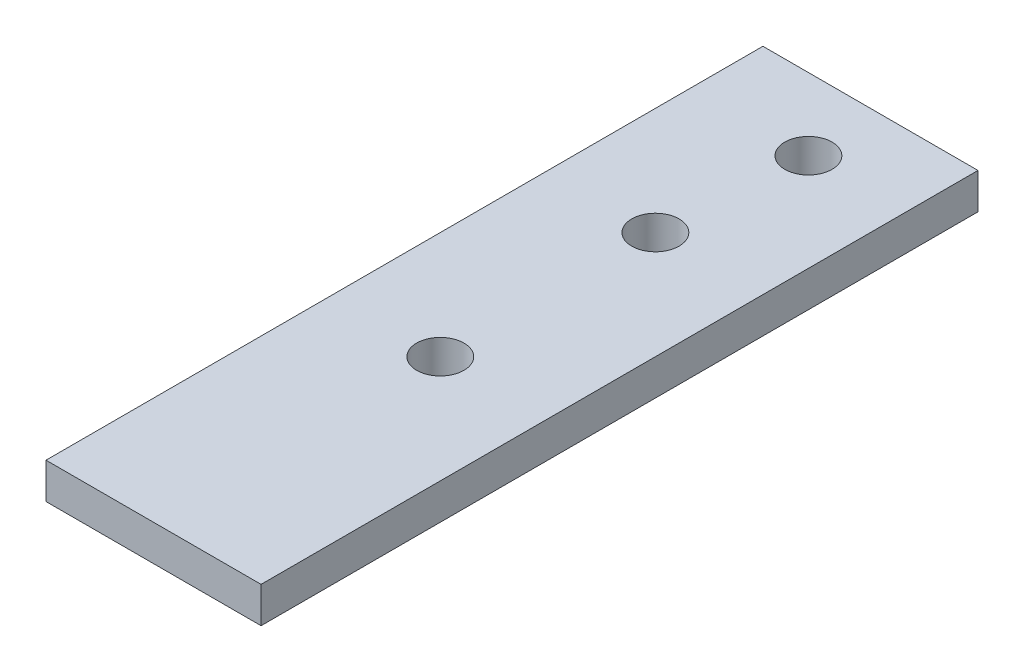
ISO-10303-21;
HEADER;
FILE_DESCRIPTION(('STEP AP214'),'2;1');
FILE_NAME('part.step','',(''),(''),'','','');
FILE_SCHEMA(('AUTOMOTIVE_DESIGN { 1 0 10303 214 1 1 1 1 }'));
ENDSEC;
DATA;
#1=APPLICATION_CONTEXT('core data for automotive mechanical design processes');
#2=APPLICATION_PROTOCOL_DEFINITION('international standard','automotive_design',2000,#1);
#3=PRODUCT_CONTEXT('',#1,'mechanical');
#4=PRODUCT('Part','Part','',(#3));
#5=PRODUCT_RELATED_PRODUCT_CATEGORY('part','',(#4));
#6=PRODUCT_DEFINITION_FORMATION('','',#4);
#7=PRODUCT_DEFINITION_CONTEXT('part definition',#1,'design');
#8=PRODUCT_DEFINITION('design','',#6,#7);
#9=PRODUCT_DEFINITION_SHAPE('','',#8);
#10=(LENGTH_UNIT() NAMED_UNIT(*) SI_UNIT(.MILLI.,.METRE.));
#11=(NAMED_UNIT(*) PLANE_ANGLE_UNIT() SI_UNIT($,.RADIAN.));
#12=(NAMED_UNIT(*) SI_UNIT($,.STERADIAN.) SOLID_ANGLE_UNIT());
#13=UNCERTAINTY_MEASURE_WITH_UNIT(LENGTH_MEASURE(1.E-05),#10,'distance_accuracy_value','');
#14=(GEOMETRIC_REPRESENTATION_CONTEXT(3) GLOBAL_UNCERTAINTY_ASSIGNED_CONTEXT((#13)) GLOBAL_UNIT_ASSIGNED_CONTEXT((#10,
#11,#12)) REPRESENTATION_CONTEXT('',''));
#15=CARTESIAN_POINT('',(0.,0.,0.));
#16=DIRECTION('',(0.,0.,1.));
#17=DIRECTION('',(1.,0.,0.));
#18=AXIS2_PLACEMENT_3D('',#15,#16,#17);
#19=CARTESIAN_POINT('',(0.,6.35,0.));
#20=DIRECTION('',(0.,1.,0.));
#21=DIRECTION('',(0.,0.,1.));
#22=AXIS2_PLACEMENT_3D('',#19,#20,#21);
#23=PLANE('',#22);
#24=CARTESIAN_POINT('',(19.05,6.35,-50.8));
#25=DIRECTION('',(0.,1.,0.));
#26=DIRECTION('',(0.,0.,1.));
#27=AXIS2_PLACEMENT_3D('',#24,#25,#26);
#28=CIRCLE('',#27,4.191);
#29=CARTESIAN_POINT('',(19.05,6.35,-46.609));
#30=VERTEX_POINT('',#29);
#31=EDGE_CURVE('E159',#30,#30,#28,.T.);
#32=ORIENTED_EDGE('',*,*,#31,.F.);
#33=EDGE_LOOP('',(#32));
#34=FACE_BOUND('',#33,.T.);
#35=DIRECTION('',(1.,0.,0.));
#36=VECTOR('',#35,1.);
#37=CARTESIAN_POINT('',(0.,6.35,-88.9));
#38=LINE('',#37,#36);
#39=CARTESIAN_POINT('',(0.,6.35,-88.9));
#40=VERTEX_POINT('',#39);
#41=CARTESIAN_POINT('',(38.1,6.35,-88.9));
#42=VERTEX_POINT('',#41);
#43=EDGE_CURVE('E134',#40,#42,#38,.T.);
#44=ORIENTED_EDGE('',*,*,#43,.F.);
#45=DIRECTION('',(0.,0.,-1.));
#46=VECTOR('',#45,1.);
#47=CARTESIAN_POINT('',(0.,6.35,0.));
#48=LINE('',#47,#46);
#49=CARTESIAN_POINT('',(0.,6.35,38.1));
#50=VERTEX_POINT('',#49);
#51=EDGE_CURVE('E114',#50,#40,#48,.T.);
#52=ORIENTED_EDGE('',*,*,#51,.F.);
#53=DIRECTION('',(-1.,0.,0.));
#54=VECTOR('',#53,1.);
#55=CARTESIAN_POINT('',(0.,6.35,38.1));
#56=LINE('',#55,#54);
#57=CARTESIAN_POINT('',(38.1,6.35,38.1));
#58=VERTEX_POINT('',#57);
#59=EDGE_CURVE('E147',#58,#50,#56,.T.);
#60=ORIENTED_EDGE('',*,*,#59,.F.);
#61=DIRECTION('',(0.,0.,-1.));
#62=VECTOR('',#61,1.);
#63=CARTESIAN_POINT('',(38.1,6.35,0.));
#64=LINE('',#63,#62);
#65=EDGE_CURVE('E172',#58,#42,#64,.T.);
#66=ORIENTED_EDGE('',*,*,#65,.T.);
#67=EDGE_LOOP('',(#44,#52,#60,#66));
#68=FACE_BOUND('',#67,.T.);
#69=CARTESIAN_POINT('',(19.05,6.35,-12.7));
#70=DIRECTION('',(0.,1.,0.));
#71=DIRECTION('',(0.,0.,1.));
#72=AXIS2_PLACEMENT_3D('',#69,#70,#71);
#73=CIRCLE('',#72,4.191);
#74=CARTESIAN_POINT('',(19.05,6.35,-8.509));
#75=VERTEX_POINT('',#74);
#76=EDGE_CURVE('E165',#75,#75,#73,.T.);
#77=ORIENTED_EDGE('',*,*,#76,.F.);
#78=EDGE_LOOP('',(#77));
#79=FACE_BOUND('',#78,.T.);
#80=CARTESIAN_POINT('',(20.8218144331006,6.35,-76.1381268765995));
#81=DIRECTION('',(0.,1.,0.));
#82=DIRECTION('',(0.,0.,1.));
#83=AXIS2_PLACEMENT_3D('',#80,#81,#82);
#84=CIRCLE('',#83,4.19100000000001);
#85=CARTESIAN_POINT('',(20.8218144331006,6.35,-71.9471268765995));
#86=VERTEX_POINT('',#85);
#87=EDGE_CURVE('E153',#86,#86,#84,.T.);
#88=ORIENTED_EDGE('',*,*,#87,.F.);
#89=EDGE_LOOP('',(#88));
#90=FACE_BOUND('',#89,.T.);
#91=ADVANCED_FACE('F84',(#34,#68,#79,#90),#23,.T.);
#92=CARTESIAN_POINT('',(0.,0.,0.));
#93=DIRECTION('',(0.,1.,0.));
#94=DIRECTION('',(0.,0.,1.));
#95=AXIS2_PLACEMENT_3D('',#92,#93,#94);
#96=PLANE('',#95);
#97=DIRECTION('',(1.,0.,0.));
#98=VECTOR('',#97,1.);
#99=CARTESIAN_POINT('',(0.,0.,-88.9));
#100=LINE('',#99,#98);
#101=CARTESIAN_POINT('',(0.,0.,-88.9));
#102=VERTEX_POINT('',#101);
#103=CARTESIAN_POINT('',(38.1,0.,-88.9));
#104=VERTEX_POINT('',#103);
#105=EDGE_CURVE('E168',#102,#104,#100,.T.);
#106=ORIENTED_EDGE('',*,*,#105,.T.);
#107=DIRECTION('',(0.,0.,-1.));
#108=VECTOR('',#107,1.);
#109=CARTESIAN_POINT('',(38.1,0.,0.));
#110=LINE('',#109,#108);
#111=CARTESIAN_POINT('',(38.1,0.,38.1));
#112=VERTEX_POINT('',#111);
#113=EDGE_CURVE('E135',#112,#104,#110,.T.);
#114=ORIENTED_EDGE('',*,*,#113,.F.);
#115=DIRECTION('',(1.,0.,0.));
#116=VECTOR('',#115,1.);
#117=CARTESIAN_POINT('',(0.,0.,38.1));
#118=LINE('',#117,#116);
#119=CARTESIAN_POINT('',(0.,0.,38.1));
#120=VERTEX_POINT('',#119);
#121=EDGE_CURVE('E138',#120,#112,#118,.T.);
#122=ORIENTED_EDGE('',*,*,#121,.F.);
#123=DIRECTION('',(0.,0.,-1.));
#124=VECTOR('',#123,1.);
#125=CARTESIAN_POINT('',(0.,0.,0.));
#126=LINE('',#125,#124);
#127=EDGE_CURVE('E127',#120,#102,#126,.T.);
#128=ORIENTED_EDGE('',*,*,#127,.T.);
#129=EDGE_LOOP('',(#106,#114,#122,#128));
#130=FACE_BOUND('',#129,.T.);
#131=CARTESIAN_POINT('',(19.05,0.,-12.7));
#132=DIRECTION('',(0.,1.,0.));
#133=DIRECTION('',(0.,0.,1.));
#134=AXIS2_PLACEMENT_3D('',#131,#132,#133);
#135=CIRCLE('',#134,4.191);
#136=CARTESIAN_POINT('',(19.05,0.,-8.509));
#137=VERTEX_POINT('',#136);
#138=EDGE_CURVE('E162',#137,#137,#135,.T.);
#139=ORIENTED_EDGE('',*,*,#138,.T.);
#140=EDGE_LOOP('',(#139));
#141=FACE_BOUND('',#140,.T.);
#142=CARTESIAN_POINT('',(19.05,0.,-50.8));
#143=DIRECTION('',(0.,1.,0.));
#144=DIRECTION('',(0.,0.,1.));
#145=AXIS2_PLACEMENT_3D('',#142,#143,#144);
#146=CIRCLE('',#145,4.191);
#147=CARTESIAN_POINT('',(19.05,0.,-46.609));
#148=VERTEX_POINT('',#147);
#149=EDGE_CURVE('E156',#148,#148,#146,.T.);
#150=ORIENTED_EDGE('',*,*,#149,.T.);
#151=EDGE_LOOP('',(#150));
#152=FACE_BOUND('',#151,.T.);
#153=CARTESIAN_POINT('',(20.8218144331006,0.,-76.1381268765995));
#154=DIRECTION('',(0.,1.,0.));
#155=DIRECTION('',(0.,0.,1.));
#156=AXIS2_PLACEMENT_3D('',#153,#154,#155);
#157=CIRCLE('',#156,4.19100000000001);
#158=CARTESIAN_POINT('',(20.8218144331006,0.,-71.9471268765995));
#159=VERTEX_POINT('',#158);
#160=EDGE_CURVE('E152',#159,#159,#157,.T.);
#161=ORIENTED_EDGE('',*,*,#160,.T.);
#162=EDGE_LOOP('',(#161));
#163=FACE_BOUND('',#162,.T.);
#164=ADVANCED_FACE('F139',(#130,#141,#152,#163),#96,.F.);
#165=CARTESIAN_POINT('',(0.,6.35,-88.9));
#166=DIRECTION('',(0.,0.,-1.));
#167=DIRECTION('',(-1.,0.,0.));
#168=AXIS2_PLACEMENT_3D('',#165,#166,#167);
#169=PLANE('',#168);
#170=ORIENTED_EDGE('',*,*,#105,.F.);
#171=DIRECTION('',(0.,-1.,0.));
#172=VECTOR('',#171,1.);
#173=CARTESIAN_POINT('',(0.,6.35,-88.9));
#174=LINE('',#173,#172);
#175=EDGE_CURVE('E12',#40,#102,#174,.T.);
#176=ORIENTED_EDGE('',*,*,#175,.F.);
#177=ORIENTED_EDGE('',*,*,#43,.T.);
#178=DIRECTION('',(0.,-1.,0.));
#179=VECTOR('',#178,1.);
#180=CARTESIAN_POINT('',(38.1,6.35,-88.9));
#181=LINE('',#180,#179);
#182=EDGE_CURVE('E88',#42,#104,#181,.T.);
#183=ORIENTED_EDGE('',*,*,#182,.T.);
#184=EDGE_LOOP('',(#170,#176,#177,#183));
#185=FACE_BOUND('',#184,.T.);
#186=ADVANCED_FACE('F86',(#185),#169,.T.);
#187=CARTESIAN_POINT('',(0.,6.35,0.));
#188=DIRECTION('',(-1.,0.,0.));
#189=DIRECTION('',(0.,0.,1.));
#190=AXIS2_PLACEMENT_3D('',#187,#188,#189);
#191=PLANE('',#190);
#192=ORIENTED_EDGE('',*,*,#127,.F.);
#193=DIRECTION('',(0.,-1.,0.));
#194=VECTOR('',#193,1.);
#195=CARTESIAN_POINT('',(0.,6.35,38.1));
#196=LINE('',#195,#194);
#197=EDGE_CURVE('E131',#50,#120,#196,.T.);
#198=ORIENTED_EDGE('',*,*,#197,.F.);
#199=ORIENTED_EDGE('',*,*,#51,.T.);
#200=ORIENTED_EDGE('',*,*,#175,.T.);
#201=EDGE_LOOP('',(#192,#198,#199,#200));
#202=FACE_BOUND('',#201,.T.);
#203=ADVANCED_FACE('F129',(#202),#191,.T.);
#204=CARTESIAN_POINT('',(38.1,6.35,0.));
#205=DIRECTION('',(-1.,0.,0.));
#206=DIRECTION('',(0.,0.,1.));
#207=AXIS2_PLACEMENT_3D('',#204,#205,#206);
#208=PLANE('',#207);
#209=ORIENTED_EDGE('',*,*,#113,.T.);
#210=ORIENTED_EDGE('',*,*,#182,.F.);
#211=ORIENTED_EDGE('',*,*,#65,.F.);
#212=DIRECTION('',(0.,1.,0.));
#213=VECTOR('',#212,1.);
#214=CARTESIAN_POINT('',(38.1,6.35,38.1));
#215=LINE('',#214,#213);
#216=EDGE_CURVE('E144',#112,#58,#215,.T.);
#217=ORIENTED_EDGE('',*,*,#216,.F.);
#218=EDGE_LOOP('',(#209,#210,#211,#217));
#219=FACE_BOUND('',#218,.T.);
#220=ADVANCED_FACE('F177',(#219),#208,.F.);
#221=CARTESIAN_POINT('',(19.05,6.35,-12.7));
#222=DIRECTION('',(0.,-1.,0.));
#223=DIRECTION('',(0.,0.,-1.));
#224=AXIS2_PLACEMENT_3D('',#221,#222,#223);
#225=CYLINDRICAL_SURFACE('',#224,4.191);
#226=ORIENTED_EDGE('',*,*,#76,.T.);
#227=EDGE_LOOP('',(#226));
#228=FACE_BOUND('',#227,.T.);
#229=ORIENTED_EDGE('',*,*,#138,.F.);
#230=EDGE_LOOP('',(#229));
#231=FACE_BOUND('',#230,.T.);
#232=ADVANCED_FACE('F194',(#228,#231),#225,.F.);
#233=CARTESIAN_POINT('',(19.05,6.35,-50.8));
#234=DIRECTION('',(0.,-1.,0.));
#235=DIRECTION('',(0.,0.,-1.));
#236=AXIS2_PLACEMENT_3D('',#233,#234,#235);
#237=CYLINDRICAL_SURFACE('',#236,4.191);
#238=ORIENTED_EDGE('',*,*,#31,.T.);
#239=EDGE_LOOP('',(#238));
#240=FACE_BOUND('',#239,.T.);
#241=ORIENTED_EDGE('',*,*,#149,.F.);
#242=EDGE_LOOP('',(#241));
#243=FACE_BOUND('',#242,.T.);
#244=ADVANCED_FACE('F200',(#240,#243),#237,.F.);
#245=CARTESIAN_POINT('',(20.8218144331006,6.35,-76.1381268765995));
#246=DIRECTION('',(0.,-1.,0.));
#247=DIRECTION('',(0.,0.,-1.));
#248=AXIS2_PLACEMENT_3D('',#245,#246,#247);
#249=CYLINDRICAL_SURFACE('',#248,4.19100000000001);
#250=ORIENTED_EDGE('',*,*,#87,.T.);
#251=EDGE_LOOP('',(#250));
#252=FACE_BOUND('',#251,.T.);
#253=ORIENTED_EDGE('',*,*,#160,.F.);
#254=EDGE_LOOP('',(#253));
#255=FACE_BOUND('',#254,.T.);
#256=ADVANCED_FACE('F205',(#252,#255),#249,.F.);
#257=CARTESIAN_POINT('',(0.,0.,38.1));
#258=DIRECTION('',(0.,0.,1.));
#259=DIRECTION('',(1.,0.,0.));
#260=AXIS2_PLACEMENT_3D('',#257,#258,#259);
#261=PLANE('',#260);
#262=ORIENTED_EDGE('',*,*,#197,.T.);
#263=ORIENTED_EDGE('',*,*,#121,.T.);
#264=ORIENTED_EDGE('',*,*,#216,.T.);
#265=ORIENTED_EDGE('',*,*,#59,.T.);
#266=EDGE_LOOP('',(#262,#263,#264,#265));
#267=FACE_BOUND('',#266,.T.);
#268=ADVANCED_FACE('F146',(#267),#261,.T.);
#269=CLOSED_SHELL('',(#91,#164,#186,#203,#220,#232,#244,#256,#268));
#270=MANIFOLD_SOLID_BREP('B2',#269);
#271=ADVANCED_BREP_SHAPE_REPRESENTATION('',(#18,#270),#14);
#272=SHAPE_DEFINITION_REPRESENTATION(#9,#271);
ENDSEC;
END-ISO-10303-21;
